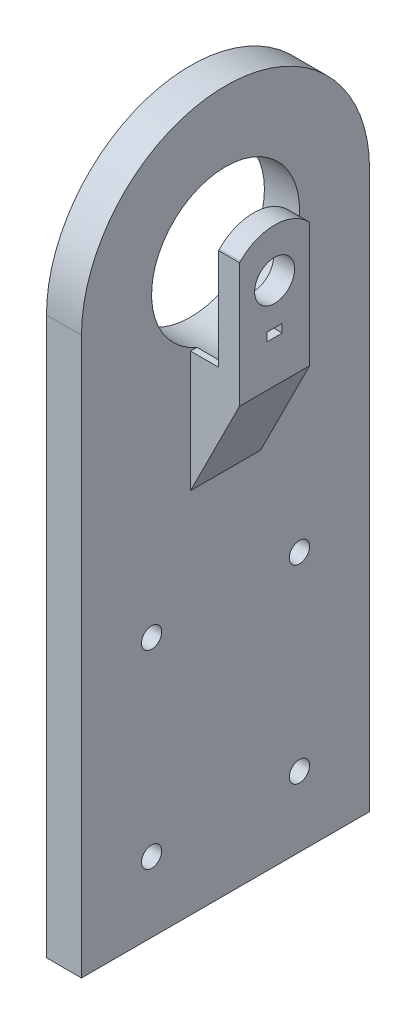
ISO-10303-21;
HEADER;
FILE_DESCRIPTION(('STEP AP214'),'2;1');
FILE_NAME('part.step','',(''),(''),'','','');
FILE_SCHEMA(('AUTOMOTIVE_DESIGN { 1 0 10303 214 1 1 1 1 }'));
ENDSEC;
DATA;
#1=APPLICATION_CONTEXT('core data for automotive mechanical design processes');
#2=APPLICATION_PROTOCOL_DEFINITION('international standard','automotive_design',2000,#1);
#3=PRODUCT_CONTEXT('',#1,'mechanical');
#4=PRODUCT('Part','Part','',(#3));
#5=PRODUCT_RELATED_PRODUCT_CATEGORY('part','',(#4));
#6=PRODUCT_DEFINITION_FORMATION('','',#4);
#7=PRODUCT_DEFINITION_CONTEXT('part definition',#1,'design');
#8=PRODUCT_DEFINITION('design','',#6,#7);
#9=PRODUCT_DEFINITION_SHAPE('','',#8);
#10=(LENGTH_UNIT() NAMED_UNIT(*) SI_UNIT(.MILLI.,.METRE.));
#11=(NAMED_UNIT(*) PLANE_ANGLE_UNIT() SI_UNIT($,.RADIAN.));
#12=(NAMED_UNIT(*) SI_UNIT($,.STERADIAN.) SOLID_ANGLE_UNIT());
#13=UNCERTAINTY_MEASURE_WITH_UNIT(LENGTH_MEASURE(1.E-05),#10,'distance_accuracy_value','');
#14=(GEOMETRIC_REPRESENTATION_CONTEXT(3) GLOBAL_UNCERTAINTY_ASSIGNED_CONTEXT((#13)) GLOBAL_UNIT_ASSIGNED_CONTEXT((#10,
#11,#12)) REPRESENTATION_CONTEXT('',''));
#15=CARTESIAN_POINT('',(0.,0.,0.));
#16=DIRECTION('',(0.,0.,1.));
#17=DIRECTION('',(1.,0.,0.));
#18=AXIS2_PLACEMENT_3D('',#15,#16,#17);
#19=CARTESIAN_POINT('',(15.24,88.5199666537295,-30.0012097287964));
#20=DIRECTION('',(0.,1.,0.));
#21=DIRECTION('',(0.,0.,1.));
#22=AXIS2_PLACEMENT_3D('',#19,#20,#21);
#23=PLANE('',#22);
#24=DIRECTION('',(-1.,0.,0.));
#25=VECTOR('',#24,1.);
#26=CARTESIAN_POINT('',(49.3266808309119,88.5199666537295,-5.18129047431067));
#27=LINE('',#26,#25);
#28=CARTESIAN_POINT('',(11.43,88.5199666537295,-5.18129047431067));
#29=VERTEX_POINT('',#28);
#30=CARTESIAN_POINT('',(6.35,88.5199666537295,-5.18129047431064));
#31=VERTEX_POINT('',#30);
#32=EDGE_CURVE('E165',#29,#31,#27,.T.);
#33=ORIENTED_EDGE('',*,*,#32,.F.);
#34=DIRECTION('',(0.,0.,-1.));
#35=VECTOR('',#34,1.);
#36=CARTESIAN_POINT('',(11.43,88.5199666537295,-30.0012097287964));
#37=LINE('',#36,#35);
#38=CARTESIAN_POINT('',(11.43,88.5199666537295,-6.35000000000001));
#39=VERTEX_POINT('',#38);
#40=EDGE_CURVE('E43',#29,#39,#37,.T.);
#41=ORIENTED_EDGE('',*,*,#40,.T.);
#42=DIRECTION('',(-1.,0.,0.));
#43=VECTOR('',#42,1.);
#44=CARTESIAN_POINT('',(15.24,88.5199666537295,-6.35000000000001));
#45=LINE('',#44,#43);
#46=CARTESIAN_POINT('',(6.35,88.5199666537295,-6.35000000000001));
#47=VERTEX_POINT('',#46);
#48=EDGE_CURVE('E58',#39,#47,#45,.T.);
#49=ORIENTED_EDGE('',*,*,#48,.T.);
#50=DIRECTION('',(0.,0.,1.));
#51=VECTOR('',#50,1.);
#52=CARTESIAN_POINT('',(6.35,88.5199666537295,-30.0012097287964));
#53=LINE('',#52,#51);
#54=EDGE_CURVE('E172',#47,#31,#53,.T.);
#55=ORIENTED_EDGE('',*,*,#54,.T.);
#56=EDGE_LOOP('',(#33,#41,#49,#55));
#57=FACE_BOUND('',#56,.T.);
#58=ADVANCED_FACE('F35',(#57),#23,.T.);
#59=DIRECTION('',(-1.,0.,0.));
#60=VECTOR('',#59,1.);
#61=CARTESIAN_POINT('',(49.3266808309119,88.5199666537295,5.18129047431065));
#62=LINE('',#61,#60);
#63=CARTESIAN_POINT('',(6.35,88.5199666537295,5.18129047431064));
#64=VERTEX_POINT('',#63);
#65=CARTESIAN_POINT('',(11.43,88.5199666537295,5.18129047431065));
#66=VERTEX_POINT('',#65);
#67=EDGE_CURVE('E167',#64,#66,#62,.F.);
#68=ORIENTED_EDGE('',*,*,#67,.F.);
#69=CARTESIAN_POINT('',(6.35,88.5199666537295,6.34999999999999));
#70=VERTEX_POINT('',#69);
#71=EDGE_CURVE('E178',#64,#70,#53,.T.);
#72=ORIENTED_EDGE('',*,*,#71,.T.);
#73=DIRECTION('',(-1.,0.,0.));
#74=VECTOR('',#73,1.);
#75=CARTESIAN_POINT('',(15.24,88.5199666537295,6.34999999999999));
#76=LINE('',#75,#74);
#77=CARTESIAN_POINT('',(11.43,88.5199666537295,6.34999999999999));
#78=VERTEX_POINT('',#77);
#79=EDGE_CURVE('E219',#78,#70,#76,.T.);
#80=ORIENTED_EDGE('',*,*,#79,.F.);
#81=EDGE_CURVE('E11',#78,#66,#37,.T.);
#82=ORIENTED_EDGE('',*,*,#81,.T.);
#83=EDGE_LOOP('',(#68,#72,#80,#82));
#84=FACE_BOUND('',#83,.T.);
#85=ADVANCED_FACE('F309',(#84),#23,.T.);
#86=CARTESIAN_POINT('',(6.35,100.8761,0.));
#87=DIRECTION('',(1.,0.,0.));
#88=DIRECTION('',(0.,0.,-1.));
#89=AXIS2_PLACEMENT_3D('',#86,#87,#88);
#90=PLANE('',#89);
#91=ORIENTED_EDGE('',*,*,#54,.F.);
#92=DIRECTION('',(0.,-1.,0.));
#93=VECTOR('',#92,1.);
#94=CARTESIAN_POINT('',(6.35,88.5199666537295,-6.35000000000001));
#95=LINE('',#94,#93);
#96=CARTESIAN_POINT('',(6.35,66.6031324472225,-6.35000000000001));
#97=VERTEX_POINT('',#96);
#98=EDGE_CURVE('E189',#47,#97,#95,.T.);
#99=ORIENTED_EDGE('',*,*,#98,.T.);
#100=DIRECTION('',(0.,0.,1.));
#101=VECTOR('',#100,1.);
#102=CARTESIAN_POINT('',(6.35,66.6031324472225,-30.0012097287964));
#103=LINE('',#102,#101);
#104=CARTESIAN_POINT('',(6.35,66.6031324472225,6.34999999999999));
#105=VERTEX_POINT('',#104);
#106=EDGE_CURVE('E190',#97,#105,#103,.T.);
#107=ORIENTED_EDGE('',*,*,#106,.T.);
#108=DIRECTION('',(0.,-1.,0.));
#109=VECTOR('',#108,1.);
#110=CARTESIAN_POINT('',(6.35,88.5199666537295,6.34999999999999));
#111=LINE('',#110,#109);
#112=EDGE_CURVE('E195',#70,#105,#111,.T.);
#113=ORIENTED_EDGE('',*,*,#112,.F.);
#114=ORIENTED_EDGE('',*,*,#71,.F.);
#115=CARTESIAN_POINT('',(6.35,100.8761,0.));
#116=DIRECTION('',(1.,0.,0.));
#117=DIRECTION('',(0.,0.,-1.));
#118=AXIS2_PLACEMENT_3D('',#115,#116,#117);
#119=CIRCLE('',#118,13.3985);
#120=EDGE_CURVE('E395',#31,#64,#119,.T.);
#121=ORIENTED_EDGE('',*,*,#120,.F.);
#122=EDGE_LOOP('',(#91,#99,#107,#113,#114,#121));
#123=FACE_BOUND('',#122,.T.);
#124=CARTESIAN_POINT('',(6.35,47.0789,13.3985));
#125=DIRECTION('',(1.,0.,0.));
#126=DIRECTION('',(0.,0.,-1.));
#127=AXIS2_PLACEMENT_3D('',#124,#125,#126);
#128=CIRCLE('',#127,1.8415);
#129=CARTESIAN_POINT('',(6.35,47.0789,11.557));
#130=VERTEX_POINT('',#129);
#131=EDGE_CURVE('E415',#130,#130,#128,.T.);
#132=ORIENTED_EDGE('',*,*,#131,.F.);
#133=EDGE_LOOP('',(#132));
#134=FACE_BOUND('',#133,.T.);
#135=CARTESIAN_POINT('',(6.35,12.7,13.3985));
#136=DIRECTION('',(1.,0.,0.));
#137=DIRECTION('',(0.,0.,-1.));
#138=AXIS2_PLACEMENT_3D('',#135,#136,#137);
#139=CIRCLE('',#138,1.8415);
#140=CARTESIAN_POINT('',(6.35,12.7,11.557));
#141=VERTEX_POINT('',#140);
#142=EDGE_CURVE('E399',#141,#141,#139,.T.);
#143=ORIENTED_EDGE('',*,*,#142,.F.);
#144=EDGE_LOOP('',(#143));
#145=FACE_BOUND('',#144,.T.);
#146=DIRECTION('',(0.,0.,-1.));
#147=VECTOR('',#146,1.);
#148=CARTESIAN_POINT('',(6.35,0.,26.0985));
#149=LINE('',#148,#147);
#150=CARTESIAN_POINT('',(6.35,0.,26.0985));
#151=VERTEX_POINT('',#150);
#152=CARTESIAN_POINT('',(6.35,0.,-26.0985));
#153=VERTEX_POINT('',#152);
#154=EDGE_CURVE('E378',#151,#153,#149,.T.);
#155=ORIENTED_EDGE('',*,*,#154,.T.);
#156=DIRECTION('',(0.,1.,0.));
#157=VECTOR('',#156,1.);
#158=CARTESIAN_POINT('',(6.35,0.,-26.0985));
#159=LINE('',#158,#157);
#160=CARTESIAN_POINT('',(6.35,100.8761,-26.0985));
#161=VERTEX_POINT('',#160);
#162=EDGE_CURVE('E392',#153,#161,#159,.T.);
#163=ORIENTED_EDGE('',*,*,#162,.T.);
#164=CARTESIAN_POINT('',(6.35,100.8761,0.));
#165=DIRECTION('',(1.,0.,0.));
#166=DIRECTION('',(0.,0.,-1.));
#167=AXIS2_PLACEMENT_3D('',#164,#165,#166);
#168=CIRCLE('',#167,26.0985);
#169=CARTESIAN_POINT('',(6.35,100.8761,26.0985));
#170=VERTEX_POINT('',#169);
#171=EDGE_CURVE('E371',#161,#170,#168,.T.);
#172=ORIENTED_EDGE('',*,*,#171,.T.);
#173=DIRECTION('',(0.,-1.,0.));
#174=VECTOR('',#173,1.);
#175=CARTESIAN_POINT('',(6.35,0.,26.0985));
#176=LINE('',#175,#174);
#177=EDGE_CURVE('E385',#170,#151,#176,.T.);
#178=ORIENTED_EDGE('',*,*,#177,.T.);
#179=EDGE_LOOP('',(#155,#163,#172,#178));
#180=FACE_BOUND('',#179,.T.);
#181=CARTESIAN_POINT('',(6.35,12.7,-13.3985));
#182=DIRECTION('',(1.,0.,0.));
#183=DIRECTION('',(0.,0.,-1.));
#184=AXIS2_PLACEMENT_3D('',#181,#182,#183);
#185=CIRCLE('',#184,1.8415);
#186=CARTESIAN_POINT('',(6.35,12.7,-15.24));
#187=VERTEX_POINT('',#186);
#188=EDGE_CURVE('E409',#187,#187,#185,.T.);
#189=ORIENTED_EDGE('',*,*,#188,.F.);
#190=EDGE_LOOP('',(#189));
#191=FACE_BOUND('',#190,.T.);
#192=CARTESIAN_POINT('',(6.35,47.0789,-13.3985));
#193=DIRECTION('',(1.,0.,0.));
#194=DIRECTION('',(0.,0.,-1.));
#195=AXIS2_PLACEMENT_3D('',#192,#193,#194);
#196=CIRCLE('',#195,1.8415);
#197=CARTESIAN_POINT('',(6.35,47.0789,-15.24));
#198=VERTEX_POINT('',#197);
#199=EDGE_CURVE('E412',#198,#198,#196,.T.);
#200=ORIENTED_EDGE('',*,*,#199,.F.);
#201=EDGE_LOOP('',(#200));
#202=FACE_BOUND('',#201,.T.);
#203=ADVANCED_FACE('F212',(#123,#134,#145,#180,#191,#202),#90,.T.);
#204=CARTESIAN_POINT('',(0.,100.8761,0.));
#205=DIRECTION('',(1.,0.,0.));
#206=DIRECTION('',(0.,0.,-1.));
#207=AXIS2_PLACEMENT_3D('',#204,#205,#206);
#208=PLANE('',#207);
#209=DIRECTION('',(0.,0.,-1.));
#210=VECTOR('',#209,1.);
#211=CARTESIAN_POINT('',(0.,0.,26.0985));
#212=LINE('',#211,#210);
#213=CARTESIAN_POINT('',(0.,0.,26.0985));
#214=VERTEX_POINT('',#213);
#215=CARTESIAN_POINT('',(0.,0.,-26.0985));
#216=VERTEX_POINT('',#215);
#217=EDGE_CURVE('E367',#214,#216,#212,.T.);
#218=ORIENTED_EDGE('',*,*,#217,.F.);
#219=DIRECTION('',(0.,-1.,0.));
#220=VECTOR('',#219,1.);
#221=CARTESIAN_POINT('',(0.,0.,26.0985));
#222=LINE('',#221,#220);
#223=CARTESIAN_POINT('',(0.,100.8761,26.0985));
#224=VERTEX_POINT('',#223);
#225=EDGE_CURVE('E376',#224,#214,#222,.T.);
#226=ORIENTED_EDGE('',*,*,#225,.F.);
#227=CARTESIAN_POINT('',(0.,100.8761,0.));
#228=DIRECTION('',(1.,0.,0.));
#229=DIRECTION('',(0.,0.,-1.));
#230=AXIS2_PLACEMENT_3D('',#227,#228,#229);
#231=CIRCLE('',#230,26.0985);
#232=CARTESIAN_POINT('',(0.,100.8761,-26.0985));
#233=VERTEX_POINT('',#232);
#234=EDGE_CURVE('E366',#233,#224,#231,.T.);
#235=ORIENTED_EDGE('',*,*,#234,.F.);
#236=DIRECTION('',(0.,1.,0.));
#237=VECTOR('',#236,1.);
#238=CARTESIAN_POINT('',(0.,0.,-26.0985));
#239=LINE('',#238,#237);
#240=EDGE_CURVE('E359',#216,#233,#239,.T.);
#241=ORIENTED_EDGE('',*,*,#240,.F.);
#242=EDGE_LOOP('',(#218,#226,#235,#241));
#243=FACE_BOUND('',#242,.T.);
#244=CARTESIAN_POINT('',(0.,100.8761,0.));
#245=DIRECTION('',(1.,0.,0.));
#246=DIRECTION('',(0.,0.,-1.));
#247=AXIS2_PLACEMENT_3D('',#244,#245,#246);
#248=CIRCLE('',#247,13.3985);
#249=CARTESIAN_POINT('',(0.,100.8761,-13.3985));
#250=VERTEX_POINT('',#249);
#251=EDGE_CURVE('E396',#250,#250,#248,.T.);
#252=ORIENTED_EDGE('',*,*,#251,.T.);
#253=EDGE_LOOP('',(#252));
#254=FACE_BOUND('',#253,.T.);
#255=CARTESIAN_POINT('',(0.,12.7,13.3985));
#256=DIRECTION('',(1.,0.,0.));
#257=DIRECTION('',(0.,0.,-1.));
#258=AXIS2_PLACEMENT_3D('',#255,#256,#257);
#259=CIRCLE('',#258,1.8415);
#260=CARTESIAN_POINT('',(0.,12.7,11.557));
#261=VERTEX_POINT('',#260);
#262=EDGE_CURVE('E402',#261,#261,#259,.T.);
#263=ORIENTED_EDGE('',*,*,#262,.T.);
#264=EDGE_LOOP('',(#263));
#265=FACE_BOUND('',#264,.T.);
#266=CARTESIAN_POINT('',(0.,12.7,-13.3985));
#267=DIRECTION('',(1.,0.,0.));
#268=DIRECTION('',(0.,0.,-1.));
#269=AXIS2_PLACEMENT_3D('',#266,#267,#268);
#270=CIRCLE('',#269,1.8415);
#271=CARTESIAN_POINT('',(0.,12.7,-15.24));
#272=VERTEX_POINT('',#271);
#273=EDGE_CURVE('E421',#272,#272,#270,.T.);
#274=ORIENTED_EDGE('',*,*,#273,.T.);
#275=EDGE_LOOP('',(#274));
#276=FACE_BOUND('',#275,.T.);
#277=CARTESIAN_POINT('',(0.,47.0789,13.3985));
#278=DIRECTION('',(1.,0.,0.));
#279=DIRECTION('',(0.,0.,-1.));
#280=AXIS2_PLACEMENT_3D('',#277,#278,#279);
#281=CIRCLE('',#280,1.8415);
#282=CARTESIAN_POINT('',(0.,47.0789,11.557));
#283=VERTEX_POINT('',#282);
#284=EDGE_CURVE('E413',#283,#283,#281,.T.);
#285=ORIENTED_EDGE('',*,*,#284,.T.);
#286=EDGE_LOOP('',(#285));
#287=FACE_BOUND('',#286,.T.);
#288=CARTESIAN_POINT('',(0.,47.0789,-13.3985));
#289=DIRECTION('',(1.,0.,0.));
#290=DIRECTION('',(0.,0.,-1.));
#291=AXIS2_PLACEMENT_3D('',#288,#289,#290);
#292=CIRCLE('',#291,1.8415);
#293=CARTESIAN_POINT('',(0.,47.0789,-15.24));
#294=VERTEX_POINT('',#293);
#295=EDGE_CURVE('E203',#294,#294,#292,.T.);
#296=ORIENTED_EDGE('',*,*,#295,.T.);
#297=EDGE_LOOP('',(#296));
#298=FACE_BOUND('',#297,.T.);
#299=ADVANCED_FACE('F317',(#243,#254,#265,#276,#287,#298),#208,.F.);
#300=CARTESIAN_POINT('',(6.35,0.,26.0985));
#301=DIRECTION('',(0.,1.,0.));
#302=DIRECTION('',(0.,0.,1.));
#303=AXIS2_PLACEMENT_3D('',#300,#301,#302);
#304=PLANE('',#303);
#305=ORIENTED_EDGE('',*,*,#217,.T.);
#306=DIRECTION('',(-1.,0.,0.));
#307=VECTOR('',#306,1.);
#308=CARTESIAN_POINT('',(6.35,0.,-26.0985));
#309=LINE('',#308,#307);
#310=EDGE_CURVE('E180',#153,#216,#309,.T.);
#311=ORIENTED_EDGE('',*,*,#310,.F.);
#312=ORIENTED_EDGE('',*,*,#154,.F.);
#313=DIRECTION('',(-1.,0.,0.));
#314=VECTOR('',#313,1.);
#315=CARTESIAN_POINT('',(6.35,0.,26.0985));
#316=LINE('',#315,#314);
#317=EDGE_CURVE('E382',#151,#214,#316,.T.);
#318=ORIENTED_EDGE('',*,*,#317,.T.);
#319=EDGE_LOOP('',(#305,#311,#312,#318));
#320=FACE_BOUND('',#319,.T.);
#321=ADVANCED_FACE('F37',(#320),#304,.F.);
#322=CARTESIAN_POINT('',(6.35,0.,-26.0985));
#323=DIRECTION('',(0.,0.,1.));
#324=DIRECTION('',(1.,0.,0.));
#325=AXIS2_PLACEMENT_3D('',#322,#323,#324);
#326=PLANE('',#325);
#327=ORIENTED_EDGE('',*,*,#240,.T.);
#328=DIRECTION('',(-1.,0.,0.));
#329=VECTOR('',#328,1.);
#330=CARTESIAN_POINT('',(6.35,100.8761,-26.0985));
#331=LINE('',#330,#329);
#332=EDGE_CURVE('E186',#161,#233,#331,.T.);
#333=ORIENTED_EDGE('',*,*,#332,.F.);
#334=ORIENTED_EDGE('',*,*,#162,.F.);
#335=ORIENTED_EDGE('',*,*,#310,.T.);
#336=EDGE_LOOP('',(#327,#333,#334,#335));
#337=FACE_BOUND('',#336,.T.);
#338=ADVANCED_FACE('F350',(#337),#326,.F.);
#339=CARTESIAN_POINT('',(6.35,100.8761,0.));
#340=DIRECTION('',(-1.,0.,0.));
#341=DIRECTION('',(0.,0.,1.));
#342=AXIS2_PLACEMENT_3D('',#339,#340,#341);
#343=CYLINDRICAL_SURFACE('',#342,26.0985);
#344=ORIENTED_EDGE('',*,*,#234,.T.);
#345=DIRECTION('',(-1.,0.,0.));
#346=VECTOR('',#345,1.);
#347=CARTESIAN_POINT('',(6.35,100.8761,26.0985));
#348=LINE('',#347,#346);
#349=EDGE_CURVE('E372',#170,#224,#348,.T.);
#350=ORIENTED_EDGE('',*,*,#349,.F.);
#351=ORIENTED_EDGE('',*,*,#171,.F.);
#352=ORIENTED_EDGE('',*,*,#332,.T.);
#353=EDGE_LOOP('',(#344,#350,#351,#352));
#354=FACE_BOUND('',#353,.T.);
#355=ADVANCED_FACE('F347',(#354),#343,.T.);
#356=CARTESIAN_POINT('',(6.35,0.,26.0985));
#357=DIRECTION('',(0.,0.,-1.));
#358=DIRECTION('',(-1.,0.,0.));
#359=AXIS2_PLACEMENT_3D('',#356,#357,#358);
#360=PLANE('',#359);
#361=ORIENTED_EDGE('',*,*,#225,.T.);
#362=ORIENTED_EDGE('',*,*,#317,.F.);
#363=ORIENTED_EDGE('',*,*,#177,.F.);
#364=ORIENTED_EDGE('',*,*,#349,.T.);
#365=EDGE_LOOP('',(#361,#362,#363,#364));
#366=FACE_BOUND('',#365,.T.);
#367=ADVANCED_FACE('F340',(#366),#360,.F.);
#368=CARTESIAN_POINT('',(6.35,100.8761,0.));
#369=DIRECTION('',(-1.,0.,0.));
#370=DIRECTION('',(0.,0.,1.));
#371=AXIS2_PLACEMENT_3D('',#368,#369,#370);
#372=CYLINDRICAL_SURFACE('',#371,13.3985);
#373=ORIENTED_EDGE('',*,*,#120,.T.);
#374=ORIENTED_EDGE('',*,*,#67,.T.);
#375=CARTESIAN_POINT('',(11.43,100.8761,0.));
#376=DIRECTION('',(1.,0.,0.));
#377=DIRECTION('',(0.,0.,-1.));
#378=AXIS2_PLACEMENT_3D('',#375,#376,#377);
#379=CIRCLE('',#378,13.3985);
#380=EDGE_CURVE('E160',#29,#66,#379,.F.);
#381=ORIENTED_EDGE('',*,*,#380,.F.);
#382=ORIENTED_EDGE('',*,*,#32,.T.);
#383=EDGE_LOOP('',(#373,#374,#381,#382));
#384=FACE_BOUND('',#383,.T.);
#385=ORIENTED_EDGE('',*,*,#251,.F.);
#386=EDGE_LOOP('',(#385));
#387=FACE_BOUND('',#386,.T.);
#388=ADVANCED_FACE('F163',(#384,#387),#372,.F.);
#389=CARTESIAN_POINT('',(6.35,12.7,13.3985));
#390=DIRECTION('',(-1.,0.,0.));
#391=DIRECTION('',(0.,0.,1.));
#392=AXIS2_PLACEMENT_3D('',#389,#390,#391);
#393=CYLINDRICAL_SURFACE('',#392,1.8415);
#394=ORIENTED_EDGE('',*,*,#142,.T.);
#395=EDGE_LOOP('',(#394));
#396=FACE_BOUND('',#395,.T.);
#397=ORIENTED_EDGE('',*,*,#262,.F.);
#398=EDGE_LOOP('',(#397));
#399=FACE_BOUND('',#398,.T.);
#400=ADVANCED_FACE('F335',(#396,#399),#393,.F.);
#401=CARTESIAN_POINT('',(6.35,12.7,-13.3985));
#402=DIRECTION('',(-1.,0.,0.));
#403=DIRECTION('',(0.,0.,1.));
#404=AXIS2_PLACEMENT_3D('',#401,#402,#403);
#405=CYLINDRICAL_SURFACE('',#404,1.8415);
#406=ORIENTED_EDGE('',*,*,#188,.T.);
#407=EDGE_LOOP('',(#406));
#408=FACE_BOUND('',#407,.T.);
#409=ORIENTED_EDGE('',*,*,#273,.F.);
#410=EDGE_LOOP('',(#409));
#411=FACE_BOUND('',#410,.T.);
#412=ADVANCED_FACE('F331',(#408,#411),#405,.F.);
#413=CARTESIAN_POINT('',(6.35,47.0789,13.3985));
#414=DIRECTION('',(-1.,0.,0.));
#415=DIRECTION('',(0.,0.,1.));
#416=AXIS2_PLACEMENT_3D('',#413,#414,#415);
#417=CYLINDRICAL_SURFACE('',#416,1.8415);
#418=ORIENTED_EDGE('',*,*,#131,.T.);
#419=EDGE_LOOP('',(#418));
#420=FACE_BOUND('',#419,.T.);
#421=ORIENTED_EDGE('',*,*,#284,.F.);
#422=EDGE_LOOP('',(#421));
#423=FACE_BOUND('',#422,.T.);
#424=ADVANCED_FACE('F327',(#420,#423),#417,.F.);
#425=CARTESIAN_POINT('',(6.35,47.0789,-13.3985));
#426=DIRECTION('',(-1.,0.,0.));
#427=DIRECTION('',(0.,0.,1.));
#428=AXIS2_PLACEMENT_3D('',#425,#426,#427);
#429=CYLINDRICAL_SURFACE('',#428,1.8415);
#430=ORIENTED_EDGE('',*,*,#199,.T.);
#431=EDGE_LOOP('',(#430));
#432=FACE_BOUND('',#431,.T.);
#433=ORIENTED_EDGE('',*,*,#295,.F.);
#434=EDGE_LOOP('',(#433));
#435=FACE_BOUND('',#434,.T.);
#436=ADVANCED_FACE('F324',(#432,#435),#429,.F.);
#437=CARTESIAN_POINT('',(8.89,117.4496,-6.35000000000001));
#438=DIRECTION('',(0.,0.,-1.));
#439=DIRECTION('',(-1.,0.,0.));
#440=AXIS2_PLACEMENT_3D('',#437,#438,#439);
#441=PLANE('',#440);
#442=ORIENTED_EDGE('',*,*,#48,.F.);
#443=DIRECTION('',(0.,1.,0.));
#444=VECTOR('',#443,1.);
#445=CARTESIAN_POINT('',(11.43,49.4417237760679,-6.35000000000001));
#446=LINE('',#445,#444);
#447=CARTESIAN_POINT('',(11.43,106.82580151094,-6.35000000000001));
#448=VERTEX_POINT('',#447);
#449=EDGE_CURVE('E177',#39,#448,#446,.T.);
#450=ORIENTED_EDGE('',*,*,#449,.T.);
#451=DIRECTION('',(1.,0.,0.));
#452=VECTOR('',#451,1.);
#453=CARTESIAN_POINT('',(11.43,106.82580151094,-6.35000000000001));
#454=LINE('',#453,#452);
#455=CARTESIAN_POINT('',(15.24,106.82580151094,-6.35000000000001));
#456=VERTEX_POINT('',#455);
#457=EDGE_CURVE('E231',#448,#456,#454,.T.);
#458=ORIENTED_EDGE('',*,*,#457,.T.);
#459=DIRECTION('',(0.,1.,0.));
#460=VECTOR('',#459,1.);
#461=CARTESIAN_POINT('',(15.24,84.3026,-6.35000000000001));
#462=LINE('',#461,#460);
#463=CARTESIAN_POINT('',(15.24,84.3026,-6.35000000000001));
#464=VERTEX_POINT('',#463);
#465=EDGE_CURVE('E201',#464,#456,#462,.T.);
#466=ORIENTED_EDGE('',*,*,#465,.F.);
#467=DIRECTION('',(0.448839228344755,0.893612526265654,0.));
#468=VECTOR('',#467,1.);
#469=CARTESIAN_POINT('',(15.24,84.3026,-6.35000000000001));
#470=LINE('',#469,#468);
#471=EDGE_CURVE('E205',#97,#464,#470,.T.);
#472=ORIENTED_EDGE('',*,*,#471,.F.);
#473=ORIENTED_EDGE('',*,*,#98,.F.);
#474=EDGE_LOOP('',(#442,#450,#458,#466,#472,#473));
#475=FACE_BOUND('',#474,.T.);
#476=ADVANCED_FACE('F298',(#475),#441,.T.);
#477=CARTESIAN_POINT('',(0.,0.,6.34999999999999));
#478=DIRECTION('',(0.,0.,1.));
#479=DIRECTION('',(1.,0.,0.));
#480=AXIS2_PLACEMENT_3D('',#477,#478,#479);
#481=PLANE('',#480);
#482=DIRECTION('',(0.,-1.,0.));
#483=VECTOR('',#482,1.);
#484=CARTESIAN_POINT('',(11.43,49.4417237760679,6.34999999999999));
#485=LINE('',#484,#483);
#486=CARTESIAN_POINT('',(11.43,106.82580151094,6.34999999999999));
#487=VERTEX_POINT('',#486);
#488=EDGE_CURVE('E50',#487,#78,#485,.T.);
#489=ORIENTED_EDGE('',*,*,#488,.T.);
#490=ORIENTED_EDGE('',*,*,#79,.T.);
#491=ORIENTED_EDGE('',*,*,#112,.T.);
#492=DIRECTION('',(0.448839228344755,0.893612526265654,0.));
#493=VECTOR('',#492,1.);
#494=CARTESIAN_POINT('',(15.24,84.3026,6.34999999999999));
#495=LINE('',#494,#493);
#496=CARTESIAN_POINT('',(15.24,84.3026,6.34999999999999));
#497=VERTEX_POINT('',#496);
#498=EDGE_CURVE('E192',#105,#497,#495,.T.);
#499=ORIENTED_EDGE('',*,*,#498,.T.);
#500=DIRECTION('',(0.,1.,0.));
#501=VECTOR('',#500,1.);
#502=CARTESIAN_POINT('',(15.24,84.3026,6.34999999999999));
#503=LINE('',#502,#501);
#504=CARTESIAN_POINT('',(15.24,106.82580151094,6.34999999999999));
#505=VERTEX_POINT('',#504);
#506=EDGE_CURVE('E199',#497,#505,#503,.T.);
#507=ORIENTED_EDGE('',*,*,#506,.T.);
#508=DIRECTION('',(-1.,0.,0.));
#509=VECTOR('',#508,1.);
#510=CARTESIAN_POINT('',(11.43,106.82580151094,6.34999999999999));
#511=LINE('',#510,#509);
#512=EDGE_CURVE('E233',#505,#487,#511,.T.);
#513=ORIENTED_EDGE('',*,*,#512,.T.);
#514=EDGE_LOOP('',(#489,#490,#491,#499,#507,#513));
#515=FACE_BOUND('',#514,.T.);
#516=ADVANCED_FACE('F218',(#515),#481,.T.);
#517=CARTESIAN_POINT('',(15.24,84.3026,-30.0012097287964));
#518=DIRECTION('',(0.893612526265654,-0.448839228344755,0.));
#519=DIRECTION('',(0.448839228344755,0.893612526265654,0.));
#520=AXIS2_PLACEMENT_3D('',#517,#518,#519);
#521=PLANE('',#520);
#522=ORIENTED_EDGE('',*,*,#106,.F.);
#523=ORIENTED_EDGE('',*,*,#471,.T.);
#524=DIRECTION('',(0.,0.,1.));
#525=VECTOR('',#524,1.);
#526=CARTESIAN_POINT('',(15.24,84.3026,-30.0012097287964));
#527=LINE('',#526,#525);
#528=EDGE_CURVE('E204',#464,#497,#527,.T.);
#529=ORIENTED_EDGE('',*,*,#528,.T.);
#530=ORIENTED_EDGE('',*,*,#498,.F.);
#531=EDGE_LOOP('',(#522,#523,#529,#530));
#532=FACE_BOUND('',#531,.T.);
#533=ADVANCED_FACE('F221',(#532),#521,.T.);
#534=CARTESIAN_POINT('',(15.24,84.3026,-30.0012097287964));
#535=DIRECTION('',(1.,0.,0.));
#536=DIRECTION('',(0.,0.,-1.));
#537=AXIS2_PLACEMENT_3D('',#534,#535,#536);
#538=PLANE('',#537);
#539=ORIENTED_EDGE('',*,*,#528,.F.);
#540=ORIENTED_EDGE('',*,*,#465,.T.);
#541=DIRECTION('',(0.,-0.713796281001004,-0.700353388818199));
#542=VECTOR('',#541,1.);
#543=CARTESIAN_POINT('',(15.24,106.968824306024,-6.20967074656824));
#544=LINE('',#543,#542);
#545=CARTESIAN_POINT('',(15.24,106.968824306024,-6.20967074656824));
#546=VERTEX_POINT('',#545);
#547=EDGE_CURVE('E249',#546,#456,#544,.T.);
#548=ORIENTED_EDGE('',*,*,#547,.F.);
#549=CARTESIAN_POINT('',(15.24,100.8761,0.));
#550=DIRECTION('',(-1.,0.,0.));
#551=DIRECTION('',(0.,0.,1.));
#552=AXIS2_PLACEMENT_3D('',#549,#550,#551);
#553=CIRCLE('',#552,8.6995);
#554=CARTESIAN_POINT('',(15.24,106.968824306024,6.20967074656825));
#555=VERTEX_POINT('',#554);
#556=EDGE_CURVE('E251',#555,#546,#553,.T.);
#557=ORIENTED_EDGE('',*,*,#556,.F.);
#558=DIRECTION('',(0.,0.713796281001005,-0.700353388818198));
#559=VECTOR('',#558,1.);
#560=CARTESIAN_POINT('',(15.24,106.968824306024,6.20967074656825));
#561=LINE('',#560,#559);
#562=EDGE_CURVE('E229',#505,#555,#561,.T.);
#563=ORIENTED_EDGE('',*,*,#562,.F.);
#564=ORIENTED_EDGE('',*,*,#506,.F.);
#565=EDGE_LOOP('',(#539,#540,#548,#557,#563,#564));
#566=FACE_BOUND('',#565,.T.);
#567=DIRECTION('',(0.,1.,0.));
#568=VECTOR('',#567,1.);
#569=CARTESIAN_POINT('',(15.24,91.9226,1.40520000000001));
#570=LINE('',#569,#568);
#571=CARTESIAN_POINT('',(15.24,91.9226,1.40520000000001));
#572=VERTEX_POINT('',#571);
#573=CARTESIAN_POINT('',(15.24,93.4466,1.40520000000002));
#574=VERTEX_POINT('',#573);
#575=EDGE_CURVE('E286',#572,#574,#570,.T.);
#576=ORIENTED_EDGE('',*,*,#575,.T.);
#577=DIRECTION('',(0.,0.,-1.));
#578=VECTOR('',#577,1.);
#579=CARTESIAN_POINT('',(15.24,93.4466,1.40520000000002));
#580=LINE('',#579,#578);
#581=CARTESIAN_POINT('',(15.24,93.4466,-1.38879999999998));
#582=VERTEX_POINT('',#581);
#583=EDGE_CURVE('E283',#574,#582,#580,.T.);
#584=ORIENTED_EDGE('',*,*,#583,.T.);
#585=DIRECTION('',(0.,-1.,0.));
#586=VECTOR('',#585,1.);
#587=CARTESIAN_POINT('',(15.24,91.9226,-1.38879999999999));
#588=LINE('',#587,#586);
#589=CARTESIAN_POINT('',(15.24,91.9226,-1.38879999999999));
#590=VERTEX_POINT('',#589);
#591=EDGE_CURVE('E280',#582,#590,#588,.T.);
#592=ORIENTED_EDGE('',*,*,#591,.T.);
#593=DIRECTION('',(0.,0.,1.));
#594=VECTOR('',#593,1.);
#595=CARTESIAN_POINT('',(15.24,91.9226,1.40520000000001));
#596=LINE('',#595,#594);
#597=EDGE_CURVE('E276',#590,#572,#596,.T.);
#598=ORIENTED_EDGE('',*,*,#597,.T.);
#599=EDGE_LOOP('',(#576,#584,#592,#598));
#600=FACE_BOUND('',#599,.T.);
#601=CARTESIAN_POINT('',(15.24,100.8761,0.));
#602=DIRECTION('',(-1.,0.,0.));
#603=DIRECTION('',(0.,0.,1.));
#604=AXIS2_PLACEMENT_3D('',#601,#602,#603);
#605=CIRCLE('',#604,3.6195);
#606=CARTESIAN_POINT('',(15.24,100.8761,-3.61950000000001));
#607=VERTEX_POINT('',#606);
#608=EDGE_CURVE('E260',#607,#607,#605,.T.);
#609=ORIENTED_EDGE('',*,*,#608,.T.);
#610=EDGE_LOOP('',(#609));
#611=FACE_BOUND('',#610,.T.);
#612=ADVANCED_FACE('F226',(#566,#600,#611),#538,.T.);
#613=CARTESIAN_POINT('',(11.43,49.4417237760679,-21.15));
#614=DIRECTION('',(1.,0.,0.));
#615=DIRECTION('',(0.,0.,-1.));
#616=AXIS2_PLACEMENT_3D('',#613,#614,#615);
#617=PLANE('',#616);
#618=ORIENTED_EDGE('',*,*,#40,.F.);
#619=ORIENTED_EDGE('',*,*,#380,.T.);
#620=ORIENTED_EDGE('',*,*,#81,.F.);
#621=ORIENTED_EDGE('',*,*,#488,.F.);
#622=DIRECTION('',(0.,0.713796281001005,-0.700353388818198));
#623=VECTOR('',#622,1.);
#624=CARTESIAN_POINT('',(11.43,106.968824306024,6.20967074656825));
#625=LINE('',#624,#623);
#626=CARTESIAN_POINT('',(11.43,106.968824306024,6.20967074656825));
#627=VERTEX_POINT('',#626);
#628=EDGE_CURVE('E246',#487,#627,#625,.T.);
#629=ORIENTED_EDGE('',*,*,#628,.T.);
#630=CARTESIAN_POINT('',(11.43,100.8761,0.));
#631=DIRECTION('',(-1.,0.,0.));
#632=DIRECTION('',(0.,0.,1.));
#633=AXIS2_PLACEMENT_3D('',#630,#631,#632);
#634=CIRCLE('',#633,8.6995);
#635=CARTESIAN_POINT('',(11.43,106.968824306024,-6.20967074656824));
#636=VERTEX_POINT('',#635);
#637=EDGE_CURVE('E248',#627,#636,#634,.T.);
#638=ORIENTED_EDGE('',*,*,#637,.T.);
#639=DIRECTION('',(0.,-0.713796281001004,-0.700353388818199));
#640=VECTOR('',#639,1.);
#641=CARTESIAN_POINT('',(11.43,106.968824306024,-6.20967074656824));
#642=LINE('',#641,#640);
#643=EDGE_CURVE('E256',#636,#448,#642,.T.);
#644=ORIENTED_EDGE('',*,*,#643,.T.);
#645=ORIENTED_EDGE('',*,*,#449,.F.);
#646=EDGE_LOOP('',(#618,#619,#620,#621,#629,#638,#644,#645));
#647=FACE_BOUND('',#646,.T.);
#648=DIRECTION('',(0.,0.,-1.));
#649=VECTOR('',#648,1.);
#650=CARTESIAN_POINT('',(11.43,93.4466,1.40520000000002));
#651=LINE('',#650,#649);
#652=CARTESIAN_POINT('',(11.43,93.4466,1.40520000000002));
#653=VERTEX_POINT('',#652);
#654=CARTESIAN_POINT('',(11.43,93.4466,-1.38879999999998));
#655=VERTEX_POINT('',#654);
#656=EDGE_CURVE('E293',#653,#655,#651,.T.);
#657=ORIENTED_EDGE('',*,*,#656,.F.);
#658=DIRECTION('',(0.,1.,0.));
#659=VECTOR('',#658,1.);
#660=CARTESIAN_POINT('',(11.43,91.9226,1.40520000000001));
#661=LINE('',#660,#659);
#662=CARTESIAN_POINT('',(11.43,91.9226,1.40520000000001));
#663=VERTEX_POINT('',#662);
#664=EDGE_CURVE('E279',#663,#653,#661,.T.);
#665=ORIENTED_EDGE('',*,*,#664,.F.);
#666=DIRECTION('',(0.,0.,1.));
#667=VECTOR('',#666,1.);
#668=CARTESIAN_POINT('',(11.43,91.9226,1.40520000000001));
#669=LINE('',#668,#667);
#670=CARTESIAN_POINT('',(11.43,91.9226,-1.38879999999999));
#671=VERTEX_POINT('',#670);
#672=EDGE_CURVE('E275',#671,#663,#669,.T.);
#673=ORIENTED_EDGE('',*,*,#672,.F.);
#674=DIRECTION('',(0.,-1.,0.));
#675=VECTOR('',#674,1.);
#676=CARTESIAN_POINT('',(11.43,91.9226,-1.38879999999999));
#677=LINE('',#676,#675);
#678=EDGE_CURVE('E290',#655,#671,#677,.T.);
#679=ORIENTED_EDGE('',*,*,#678,.F.);
#680=EDGE_LOOP('',(#657,#665,#673,#679));
#681=FACE_BOUND('',#680,.T.);
#682=CARTESIAN_POINT('',(11.43,100.8761,0.));
#683=DIRECTION('',(-1.,0.,0.));
#684=DIRECTION('',(0.,0.,1.));
#685=AXIS2_PLACEMENT_3D('',#682,#683,#684);
#686=CIRCLE('',#685,3.6195);
#687=CARTESIAN_POINT('',(11.43,100.8761,-3.61950000000001));
#688=VERTEX_POINT('',#687);
#689=EDGE_CURVE('E254',#688,#688,#686,.T.);
#690=ORIENTED_EDGE('',*,*,#689,.F.);
#691=EDGE_LOOP('',(#690));
#692=FACE_BOUND('',#691,.T.);
#693=ADVANCED_FACE('F174',(#647,#681,#692),#617,.F.);
#694=CARTESIAN_POINT('',(11.43,106.968824306024,-6.20967074656824));
#695=DIRECTION('',(0.,-0.700353388818199,0.713796281001005));
#696=DIRECTION('',(0.,0.713796281001005,0.700353388818199));
#697=AXIS2_PLACEMENT_3D('',#694,#695,#696);
#698=PLANE('',#697);
#699=ORIENTED_EDGE('',*,*,#457,.F.);
#700=ORIENTED_EDGE('',*,*,#643,.F.);
#701=DIRECTION('',(1.,0.,0.));
#702=VECTOR('',#701,1.);
#703=CARTESIAN_POINT('',(11.43,106.968824306024,-6.20967074656824));
#704=LINE('',#703,#702);
#705=EDGE_CURVE('E238',#636,#546,#704,.T.);
#706=ORIENTED_EDGE('',*,*,#705,.T.);
#707=ORIENTED_EDGE('',*,*,#547,.T.);
#708=EDGE_LOOP('',(#699,#700,#706,#707));
#709=FACE_BOUND('',#708,.T.);
#710=ADVANCED_FACE('F300',(#709),#698,.F.);
#711=CARTESIAN_POINT('',(11.43,106.968824306024,6.20967074656825));
#712=DIRECTION('',(0.,-0.700353388818198,-0.713796281001005));
#713=DIRECTION('',(0.,-0.713796281001005,0.700353388818198));
#714=AXIS2_PLACEMENT_3D('',#711,#712,#713);
#715=PLANE('',#714);
#716=ORIENTED_EDGE('',*,*,#512,.F.);
#717=ORIENTED_EDGE('',*,*,#562,.T.);
#718=DIRECTION('',(1.,0.,0.));
#719=VECTOR('',#718,1.);
#720=CARTESIAN_POINT('',(11.43,106.968824306024,6.20967074656825));
#721=LINE('',#720,#719);
#722=EDGE_CURVE('E243',#627,#555,#721,.T.);
#723=ORIENTED_EDGE('',*,*,#722,.F.);
#724=ORIENTED_EDGE('',*,*,#628,.F.);
#725=EDGE_LOOP('',(#716,#717,#723,#724));
#726=FACE_BOUND('',#725,.T.);
#727=ADVANCED_FACE('F308',(#726),#715,.F.);
#728=CARTESIAN_POINT('',(11.43,100.8761,0.));
#729=DIRECTION('',(1.,0.,0.));
#730=DIRECTION('',(0.,0.,-1.));
#731=AXIS2_PLACEMENT_3D('',#728,#729,#730);
#732=CYLINDRICAL_SURFACE('',#731,8.6995);
#733=ORIENTED_EDGE('',*,*,#556,.T.);
#734=ORIENTED_EDGE('',*,*,#705,.F.);
#735=ORIENTED_EDGE('',*,*,#637,.F.);
#736=ORIENTED_EDGE('',*,*,#722,.T.);
#737=EDGE_LOOP('',(#733,#734,#735,#736));
#738=FACE_BOUND('',#737,.T.);
#739=ADVANCED_FACE('F306',(#738),#732,.T.);
#740=CARTESIAN_POINT('',(11.43,100.8761,0.));
#741=DIRECTION('',(1.,0.,0.));
#742=DIRECTION('',(0.,0.,-1.));
#743=AXIS2_PLACEMENT_3D('',#740,#741,#742);
#744=CYLINDRICAL_SURFACE('',#743,3.6195);
#745=CARTESIAN_POINT('',(11.43,100.8761,-3.61950000000001));
#746=CARTESIAN_POINT('',(11.4696875,100.8761,-3.61950000000001));
#747=CARTESIAN_POINT('',(11.509375,100.8761,-3.61950000000001));
#748=CARTESIAN_POINT('',(11.58875,100.8761,-3.61950000000001));
#749=CARTESIAN_POINT('',(11.6284375,100.8761,-3.61950000000001));
#750=CARTESIAN_POINT('',(11.7078125,100.8761,-3.61950000000001));
#751=CARTESIAN_POINT('',(11.7475,100.8761,-3.61950000000001));
#752=CARTESIAN_POINT('',(11.826875,100.8761,-3.61950000000001));
#753=CARTESIAN_POINT('',(11.8665625,100.8761,-3.61950000000001));
#754=CARTESIAN_POINT('',(11.9459375,100.8761,-3.61950000000001));
#755=CARTESIAN_POINT('',(11.985625,100.8761,-3.61950000000001));
#756=CARTESIAN_POINT('',(12.065,100.8761,-3.61950000000001));
#757=CARTESIAN_POINT('',(12.1046875,100.8761,-3.61950000000001));
#758=CARTESIAN_POINT('',(12.1840625,100.8761,-3.61950000000001));
#759=CARTESIAN_POINT('',(12.22375,100.8761,-3.61950000000001));
#760=CARTESIAN_POINT('',(12.303125,100.8761,-3.61950000000001));
#761=CARTESIAN_POINT('',(12.3428125,100.8761,-3.61950000000001));
#762=CARTESIAN_POINT('',(12.4221875,100.8761,-3.61950000000001));
#763=CARTESIAN_POINT('',(12.461875,100.8761,-3.61950000000001));
#764=CARTESIAN_POINT('',(12.54125,100.8761,-3.61950000000001));
#765=CARTESIAN_POINT('',(12.5809375,100.8761,-3.61950000000001));
#766=CARTESIAN_POINT('',(12.6603125,100.8761,-3.61950000000001));
#767=CARTESIAN_POINT('',(12.7,100.8761,-3.61950000000001));
#768=CARTESIAN_POINT('',(12.779375,100.8761,-3.61950000000001));
#769=CARTESIAN_POINT('',(12.8190625,100.8761,-3.61950000000001));
#770=CARTESIAN_POINT('',(12.8984375,100.8761,-3.61950000000001));
#771=CARTESIAN_POINT('',(12.938125,100.8761,-3.61950000000001));
#772=CARTESIAN_POINT('',(13.0175,100.8761,-3.61950000000001));
#773=CARTESIAN_POINT('',(13.0571875,100.8761,-3.61950000000001));
#774=CARTESIAN_POINT('',(13.1365625,100.8761,-3.61950000000001));
#775=CARTESIAN_POINT('',(13.17625,100.8761,-3.61950000000001));
#776=CARTESIAN_POINT('',(13.255625,100.8761,-3.61950000000001));
#777=CARTESIAN_POINT('',(13.2953125,100.8761,-3.61950000000001));
#778=CARTESIAN_POINT('',(13.3746875,100.8761,-3.61950000000001));
#779=CARTESIAN_POINT('',(13.414375,100.8761,-3.61950000000001));
#780=CARTESIAN_POINT('',(13.49375,100.8761,-3.61950000000001));
#781=CARTESIAN_POINT('',(13.5334375,100.8761,-3.61950000000001));
#782=CARTESIAN_POINT('',(13.6128125,100.8761,-3.61950000000001));
#783=CARTESIAN_POINT('',(13.6525,100.8761,-3.61950000000001));
#784=CARTESIAN_POINT('',(13.731875,100.8761,-3.61950000000001));
#785=CARTESIAN_POINT('',(13.7715625,100.8761,-3.61950000000001));
#786=CARTESIAN_POINT('',(13.8509375,100.8761,-3.61950000000001));
#787=CARTESIAN_POINT('',(13.890625,100.8761,-3.61950000000001));
#788=CARTESIAN_POINT('',(13.97,100.8761,-3.61950000000001));
#789=CARTESIAN_POINT('',(14.0096875,100.8761,-3.61950000000001));
#790=CARTESIAN_POINT('',(14.0890625,100.8761,-3.61950000000001));
#791=CARTESIAN_POINT('',(14.12875,100.8761,-3.61950000000001));
#792=CARTESIAN_POINT('',(14.208125,100.8761,-3.61950000000001));
#793=CARTESIAN_POINT('',(14.2478125,100.8761,-3.61950000000001));
#794=CARTESIAN_POINT('',(14.3271875,100.8761,-3.61950000000001));
#795=CARTESIAN_POINT('',(14.366875,100.8761,-3.61950000000001));
#796=CARTESIAN_POINT('',(14.44625,100.8761,-3.61950000000001));
#797=CARTESIAN_POINT('',(14.4859375,100.8761,-3.61950000000001));
#798=CARTESIAN_POINT('',(14.5653125,100.8761,-3.61950000000001));
#799=CARTESIAN_POINT('',(14.605,100.8761,-3.61950000000001));
#800=CARTESIAN_POINT('',(14.684375,100.8761,-3.61950000000001));
#801=CARTESIAN_POINT('',(14.7240625,100.8761,-3.61950000000001));
#802=CARTESIAN_POINT('',(14.8034375,100.8761,-3.61950000000001));
#803=CARTESIAN_POINT('',(14.843125,100.8761,-3.61950000000001));
#804=CARTESIAN_POINT('',(14.9225,100.8761,-3.61950000000001));
#805=CARTESIAN_POINT('',(14.9621875,100.8761,-3.61950000000001));
#806=CARTESIAN_POINT('',(15.0415625,100.8761,-3.61950000000001));
#807=CARTESIAN_POINT('',(15.08125,100.8761,-3.61950000000001));
#808=CARTESIAN_POINT('',(15.160625,100.8761,-3.61950000000001));
#809=CARTESIAN_POINT('',(15.2003125,100.8761,-3.61950000000001));
#810=CARTESIAN_POINT('',(15.24,100.8761,-3.61950000000001));
#811=B_SPLINE_CURVE_WITH_KNOTS('',3,(#745,#746,#747,#748,#749,#750,#751,#752,#753,#754,#755,
#756,#757,#758,#759,#760,#761,#762,#763,#764,#765,#766,#767,#768,#769,#770,#771,#772,#773,#774,
#775,#776,#777,#778,#779,#780,#781,#782,#783,#784,#785,#786,#787,#788,#789,#790,#791,#792,#793,
#794,#795,#796,#797,#798,#799,#800,#801,#802,#803,#804,#805,#806,#807,#808,#809,#810),
.UNSPECIFIED.,.F.,.F.,(4,2,2,2,2,2,2,2,2,2,2,2,2,2,2,2,2,2,2,2,2,2,2,2,2,2,2,2,2,2,2,2,4),(0.,
0.119062500000001,0.238125,0.3571875,0.476250000000001,0.5953125,0.714375,0.833437499999999,
0.9525,1.0715625,1.190625,1.3096875,1.42875,1.5478125,1.666875,1.7859375,1.905,2.0240625,
2.143125,2.2621875,2.38125,2.5003125,2.619375,2.7384375,2.8575,2.9765625,3.095625,3.2146875,
3.33375,3.4528125,3.571875,3.69093749999999,3.81),.UNSPECIFIED.);
#812=EDGE_CURVE('BSEAM514',#688,#607,#811,.T.);
#813=ORIENTED_EDGE('',*,*,#689,.T.);
#814=ORIENTED_EDGE('',*,*,#608,.F.);
#815=ORIENTED_EDGE('',*,*,#812,.T.);
#816=ORIENTED_EDGE('',*,*,#812,.F.);
#817=EDGE_LOOP('',(#813,#815,#814,#816));
#818=FACE_BOUND('',#817,.T.);
#819=ADVANCED_FACE('F514',(#818),#744,.F.);
#820=CARTESIAN_POINT('',(11.43,91.9226,1.40520000000001));
#821=DIRECTION('',(0.,0.,-1.));
#822=DIRECTION('',(0.,-1.,0.));
#823=AXIS2_PLACEMENT_3D('',#820,#821,#822);
#824=PLANE('',#823);
#825=ORIENTED_EDGE('',*,*,#575,.F.);
#826=DIRECTION('',(1.,0.,0.));
#827=VECTOR('',#826,1.);
#828=CARTESIAN_POINT('',(11.43,91.9226,1.40520000000001));
#829=LINE('',#828,#827);
#830=EDGE_CURVE('E272',#663,#572,#829,.T.);
#831=ORIENTED_EDGE('',*,*,#830,.F.);
#832=ORIENTED_EDGE('',*,*,#664,.T.);
#833=DIRECTION('',(1.,0.,0.));
#834=VECTOR('',#833,1.);
#835=CARTESIAN_POINT('',(11.43,93.4466,1.40520000000002));
#836=LINE('',#835,#834);
#837=EDGE_CURVE('E263',#653,#574,#836,.T.);
#838=ORIENTED_EDGE('',*,*,#837,.T.);
#839=EDGE_LOOP('',(#825,#831,#832,#838));
#840=FACE_BOUND('',#839,.T.);
#841=ADVANCED_FACE('F521',(#840),#824,.T.);
#842=CARTESIAN_POINT('',(11.43,93.4466,1.40520000000002));
#843=DIRECTION('',(0.,-1.,0.));
#844=DIRECTION('',(1.,0.,0.));
#845=AXIS2_PLACEMENT_3D('',#842,#843,#844);
#846=PLANE('',#845);
#847=ORIENTED_EDGE('',*,*,#583,.F.);
#848=ORIENTED_EDGE('',*,*,#837,.F.);
#849=ORIENTED_EDGE('',*,*,#656,.T.);
#850=DIRECTION('',(1.,0.,0.));
#851=VECTOR('',#850,1.);
#852=CARTESIAN_POINT('',(11.43,93.4466,-1.38879999999998));
#853=LINE('',#852,#851);
#854=EDGE_CURVE('E268',#655,#582,#853,.T.);
#855=ORIENTED_EDGE('',*,*,#854,.T.);
#856=EDGE_LOOP('',(#847,#848,#849,#855));
#857=FACE_BOUND('',#856,.T.);
#858=ADVANCED_FACE('F529',(#857),#846,.T.);
#859=CARTESIAN_POINT('',(11.43,91.9226,-1.38879999999999));
#860=DIRECTION('',(0.,0.,1.));
#861=DIRECTION('',(0.,1.,0.));
#862=AXIS2_PLACEMENT_3D('',#859,#860,#861);
#863=PLANE('',#862);
#864=ORIENTED_EDGE('',*,*,#591,.F.);
#865=ORIENTED_EDGE('',*,*,#854,.F.);
#866=ORIENTED_EDGE('',*,*,#678,.T.);
#867=DIRECTION('',(1.,0.,0.));
#868=VECTOR('',#867,1.);
#869=CARTESIAN_POINT('',(11.43,91.9226,-1.38879999999999));
#870=LINE('',#869,#868);
#871=EDGE_CURVE('E270',#671,#590,#870,.T.);
#872=ORIENTED_EDGE('',*,*,#871,.T.);
#873=EDGE_LOOP('',(#864,#865,#866,#872));
#874=FACE_BOUND('',#873,.T.);
#875=ADVANCED_FACE('F537',(#874),#863,.T.);
#876=CARTESIAN_POINT('',(11.43,91.9226,1.40520000000001));
#877=DIRECTION('',(0.,1.,0.));
#878=DIRECTION('',(-1.,0.,0.));
#879=AXIS2_PLACEMENT_3D('',#876,#877,#878);
#880=PLANE('',#879);
#881=ORIENTED_EDGE('',*,*,#597,.F.);
#882=ORIENTED_EDGE('',*,*,#871,.F.);
#883=ORIENTED_EDGE('',*,*,#672,.T.);
#884=ORIENTED_EDGE('',*,*,#830,.T.);
#885=EDGE_LOOP('',(#881,#882,#883,#884));
#886=FACE_BOUND('',#885,.T.);
#887=ADVANCED_FACE('F545',(#886),#880,.T.);
#888=CLOSED_SHELL('',(#58,#85,#203,#299,#321,#338,#355,#367,#388,#400,#412,#424,#436,#476,#516,
#533,#612,#693,#710,#727,#739,#819,#841,#858,#875,#887));
#889=MANIFOLD_SOLID_BREP('B2',#888);
#890=ADVANCED_BREP_SHAPE_REPRESENTATION('',(#18,#889),#14);
#891=SHAPE_DEFINITION_REPRESENTATION(#9,#890);
ENDSEC;
END-ISO-10303-21;
